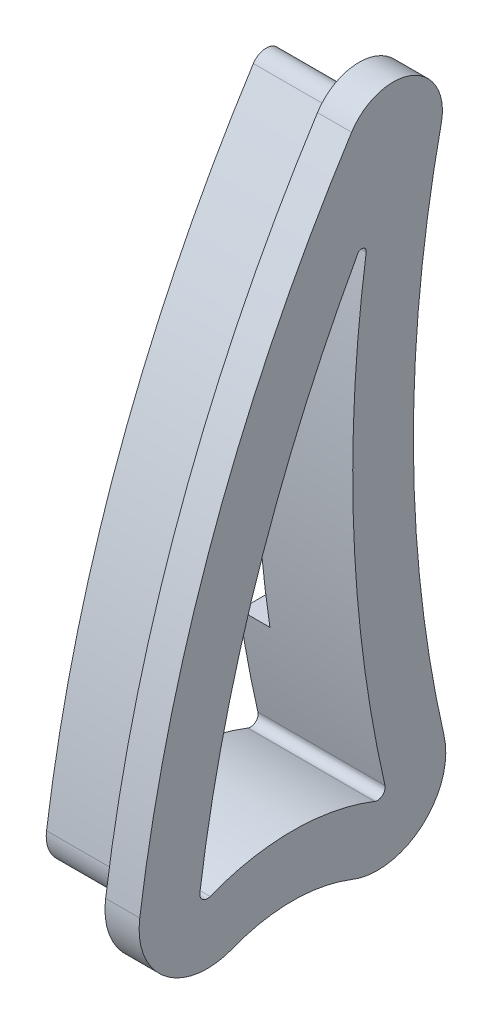
ISO-10303-21;
HEADER;
FILE_DESCRIPTION(('STEP AP214'),'2;1');
FILE_NAME('part.step','',(''),(''),'','','');
FILE_SCHEMA(('AUTOMOTIVE_DESIGN { 1 0 10303 214 1 1 1 1 }'));
ENDSEC;
DATA;
#1=APPLICATION_CONTEXT('core data for automotive mechanical design processes');
#2=APPLICATION_PROTOCOL_DEFINITION('international standard','automotive_design',2000,#1);
#3=PRODUCT_CONTEXT('',#1,'mechanical');
#4=PRODUCT('Part','Part','',(#3));
#5=PRODUCT_RELATED_PRODUCT_CATEGORY('part','',(#4));
#6=PRODUCT_DEFINITION_FORMATION('','',#4);
#7=PRODUCT_DEFINITION_CONTEXT('part definition',#1,'design');
#8=PRODUCT_DEFINITION('design','',#6,#7);
#9=PRODUCT_DEFINITION_SHAPE('','',#8);
#10=(LENGTH_UNIT() NAMED_UNIT(*) SI_UNIT(.MILLI.,.METRE.));
#11=(NAMED_UNIT(*) PLANE_ANGLE_UNIT() SI_UNIT($,.RADIAN.));
#12=(NAMED_UNIT(*) SI_UNIT($,.STERADIAN.) SOLID_ANGLE_UNIT());
#13=UNCERTAINTY_MEASURE_WITH_UNIT(LENGTH_MEASURE(1.E-05),#10,'distance_accuracy_value','');
#14=(GEOMETRIC_REPRESENTATION_CONTEXT(3) GLOBAL_UNCERTAINTY_ASSIGNED_CONTEXT((#13)) GLOBAL_UNIT_ASSIGNED_CONTEXT((#10,
#11,#12)) REPRESENTATION_CONTEXT('',''));
#15=CARTESIAN_POINT('',(0.,0.,0.));
#16=DIRECTION('',(0.,0.,1.));
#17=DIRECTION('',(1.,0.,0.));
#18=AXIS2_PLACEMENT_3D('',#15,#16,#17);
#19=CARTESIAN_POINT('',(0.,-6.20177657240364,-184.198856021998));
#20=DIRECTION('',(1.,0.,0.));
#21=DIRECTION('',(0.,0.,-1.));
#22=AXIS2_PLACEMENT_3D('',#19,#20,#21);
#23=CYLINDRICAL_SURFACE('',#22,210.385678361767);
#24=CARTESIAN_POINT('',(5.08,-6.20177657240364,-184.198856021998));
#25=DIRECTION('',(1.,0.,0.));
#26=DIRECTION('',(0.,0.,-1.));
#27=AXIS2_PLACEMENT_3D('',#24,#25,#26);
#28=CIRCLE('',#27,210.385678361767);
#29=CARTESIAN_POINT('',(5.08,16.9330409285443,24.9109569446311));
#30=VERTEX_POINT('',#29);
#31=CARTESIAN_POINT('',(5.08,-37.6769590714556,23.8190435597259));
#32=VERTEX_POINT('',#31);
#33=EDGE_CURVE('E327',#30,#32,#28,.T.);
#34=ORIENTED_EDGE('',*,*,#33,.F.);
#35=DIRECTION('',(1.,0.,0.));
#36=VECTOR('',#35,1.);
#37=CARTESIAN_POINT('',(0.,16.9330409285443,24.9109569446311));
#38=LINE('',#37,#36);
#39=CARTESIAN_POINT('',(0.,16.9330409285443,24.9109569446311));
#40=VERTEX_POINT('',#39);
#41=EDGE_CURVE('E334',#30,#40,#38,.F.);
#42=ORIENTED_EDGE('',*,*,#41,.T.);
#43=CARTESIAN_POINT('',(0.,-6.20177657240364,-184.198856021998));
#44=DIRECTION('',(-1.,0.,0.));
#45=DIRECTION('',(0.,0.,-1.));
#46=AXIS2_PLACEMENT_3D('',#43,#44,#45);
#47=CIRCLE('',#46,210.385678361767);
#48=CARTESIAN_POINT('',(0.,38.5039666862931,21.3821017037317));
#49=VERTEX_POINT('',#48);
#50=EDGE_CURVE('E380',#40,#49,#47,.T.);
#51=ORIENTED_EDGE('',*,*,#50,.T.);
#52=DIRECTION('',(1.,0.,0.));
#53=VECTOR('',#52,1.);
#54=CARTESIAN_POINT('',(0.,38.5039666862931,21.3821017037317));
#55=LINE('',#54,#53);
#56=CARTESIAN_POINT('',(15.5575,38.5039666862931,21.3821017037317));
#57=VERTEX_POINT('',#56);
#58=EDGE_CURVE('E416',#49,#57,#55,.T.);
#59=ORIENTED_EDGE('',*,*,#58,.T.);
#60=CARTESIAN_POINT('',(15.5575,-6.20177657240364,-184.198856021998));
#61=DIRECTION('',(-1.,0.,0.));
#62=DIRECTION('',(0.,0.,-1.));
#63=AXIS2_PLACEMENT_3D('',#60,#61,#62);
#64=CIRCLE('',#63,210.385678361767);
#65=CARTESIAN_POINT('',(15.5575,-53.0579844312768,20.9026540768476));
#66=VERTEX_POINT('',#65);
#67=EDGE_CURVE('E405',#66,#57,#64,.T.);
#68=ORIENTED_EDGE('',*,*,#67,.F.);
#69=DIRECTION('',(1.,0.,0.));
#70=VECTOR('',#69,1.);
#71=CARTESIAN_POINT('',(0.,-53.0579844312768,20.9026540768476));
#72=LINE('',#71,#70);
#73=CARTESIAN_POINT('',(0.,-53.0579844312768,20.9026540768476));
#74=VERTEX_POINT('',#73);
#75=EDGE_CURVE('E419',#74,#66,#72,.T.);
#76=ORIENTED_EDGE('',*,*,#75,.F.);
#77=CARTESIAN_POINT('',(0.,-37.6769590714556,23.8190435597259));
#78=VERTEX_POINT('',#77);
#79=EDGE_CURVE('E381',#74,#78,#47,.T.);
#80=ORIENTED_EDGE('',*,*,#79,.T.);
#81=DIRECTION('',(1.,0.,0.));
#82=VECTOR('',#81,1.);
#83=CARTESIAN_POINT('',(0.,-37.6769590714556,23.8190435597258));
#84=LINE('',#83,#82);
#85=EDGE_CURVE('E330',#78,#32,#84,.T.);
#86=ORIENTED_EDGE('',*,*,#85,.T.);
#87=EDGE_LOOP('',(#34,#42,#51,#59,#68,#76,#80,#86));
#88=FACE_BOUND('',#87,.T.);
#89=ADVANCED_FACE('F45',(#88),#23,.F.);
#90=CARTESIAN_POINT('',(0.,-70.0279025216978,-58.2002153134541));
#91=DIRECTION('',(1.,0.,0.));
#92=DIRECTION('',(0.,0.,-1.));
#93=AXIS2_PLACEMENT_3D('',#90,#91,#92);
#94=PLANE('',#93);
#95=DIRECTION('',(0.,0.,1.));
#96=VECTOR('',#95,1.);
#97=CARTESIAN_POINT('',(0.,16.9330409285443,11.4890333887427));
#98=LINE('',#97,#96);
#99=CARTESIAN_POINT('',(0.,16.9330409285443,29.3825115749315));
#100=VERTEX_POINT('',#99);
#101=EDGE_CURVE('E304',#40,#100,#98,.T.);
#102=ORIENTED_EDGE('',*,*,#101,.T.);
#103=CARTESIAN_POINT('',(0.,-6.20177657240364,-184.198856021998));
#104=DIRECTION('',(-1.,0.,0.));
#105=DIRECTION('',(0.,0.,-1.));
#106=AXIS2_PLACEMENT_3D('',#103,#104,#105);
#107=CIRCLE('',#106,214.830678361767);
#108=CARTESIAN_POINT('',(0.,24.8697217976994,28.3729726722427));
#109=VERTEX_POINT('',#108);
#110=EDGE_CURVE('E68',#100,#109,#107,.T.);
#111=ORIENTED_EDGE('',*,*,#110,.T.);
#112=CARTESIAN_POINT('',(0.,24.9799317636994,29.1269605789057));
#113=DIRECTION('',(1.,0.,0.));
#114=DIRECTION('',(0.,0.,-1.));
#115=AXIS2_PLACEMENT_3D('',#112,#113,#114);
#116=CIRCLE('',#115,0.762);
#117=CARTESIAN_POINT('',(0.,25.3482363803248,29.794040566143));
#118=VERTEX_POINT('',#117);
#119=EDGE_CURVE('E11',#109,#118,#116,.T.);
#120=ORIENTED_EDGE('',*,*,#119,.T.);
#121=CARTESIAN_POINT('',(0.,-85.725,-171.383815377929));
#122=DIRECTION('',(1.,0.,0.));
#123=DIRECTION('',(0.,0.,-1.));
#124=AXIS2_PLACEMENT_3D('',#121,#122,#123);
#125=CIRCLE('',#124,229.803815377929);
#126=CARTESIAN_POINT('',(0.,-54.1563423384828,56.2413445137298));
#127=VERTEX_POINT('',#126);
#128=EDGE_CURVE('E338',#118,#127,#125,.T.);
#129=ORIENTED_EDGE('',*,*,#128,.T.);
#130=CARTESIAN_POINT('',(0.,-54.3308050433957,54.9833847510209));
#131=DIRECTION('',(1.,0.,0.));
#132=DIRECTION('',(0.,0.,-1.));
#133=AXIS2_PLACEMENT_3D('',#130,#131,#132);
#134=CIRCLE('',#133,1.27);
#135=CARTESIAN_POINT('',(0.,-55.5118273435487,54.5163876134051));
#136=VERTEX_POINT('',#135);
#137=EDGE_CURVE('E205',#127,#136,#134,.T.);
#138=ORIENTED_EDGE('',*,*,#137,.T.);
#139=CARTESIAN_POINT('',(0.,-90.380368501444,40.7287487928118));
#140=DIRECTION('',(-1.,0.,0.));
#141=DIRECTION('',(0.,0.,-1.));
#142=AXIS2_PLACEMENT_3D('',#139,#140,#141);
#143=CIRCLE('',#142,37.495521688956);
#144=CARTESIAN_POINT('',(0.,-55.5118273435487,26.9411099722184));
#145=VERTEX_POINT('',#144);
#146=EDGE_CURVE('E343',#136,#145,#143,.T.);
#147=ORIENTED_EDGE('',*,*,#146,.T.);
#148=CARTESIAN_POINT('',(0.,-54.3308050433957,26.4741128346026));
#149=DIRECTION('',(1.,0.,0.));
#150=DIRECTION('',(0.,0.,-1.));
#151=AXIS2_PLACEMENT_3D('',#148,#149,#150);
#152=CIRCLE('',#151,1.27);
#153=CARTESIAN_POINT('',(0.,-54.0479560184804,25.2360108884348));
#154=VERTEX_POINT('',#153);
#155=EDGE_CURVE('E347',#145,#154,#152,.T.);
#156=ORIENTED_EDGE('',*,*,#155,.T.);
#157=CARTESIAN_POINT('',(0.,-37.6769590714555,28.3135747956562));
#158=VERTEX_POINT('',#157);
#159=EDGE_CURVE('E210',#154,#158,#107,.T.);
#160=ORIENTED_EDGE('',*,*,#159,.T.);
#161=DIRECTION('',(0.,0.,-1.));
#162=VECTOR('',#161,1.);
#163=CARTESIAN_POINT('',(0.,-37.6769590714556,10.3217925721392));
#164=LINE('',#163,#162);
#165=EDGE_CURVE('E309',#158,#78,#164,.T.);
#166=ORIENTED_EDGE('',*,*,#165,.T.);
#167=ORIENTED_EDGE('',*,*,#79,.F.);
#168=CARTESIAN_POINT('',(0.,-54.3308050433957,26.4741128346026));
#169=DIRECTION('',(1.,0.,0.));
#170=DIRECTION('',(0.,0.,-1.));
#171=AXIS2_PLACEMENT_3D('',#168,#169,#170);
#172=CIRCLE('',#171,5.715);
#173=CARTESIAN_POINT('',(0.,-59.6454053940841,28.5755999538737));
#174=VERTEX_POINT('',#173);
#175=EDGE_CURVE('E376',#174,#74,#172,.T.);
#176=ORIENTED_EDGE('',*,*,#175,.F.);
#177=CARTESIAN_POINT('',(0.,-90.380368501444,40.7287487928118));
#178=DIRECTION('',(-1.,0.,0.));
#179=DIRECTION('',(0.,0.,-1.));
#180=AXIS2_PLACEMENT_3D('',#177,#178,#179);
#181=CIRCLE('',#180,33.050521688956);
#182=CARTESIAN_POINT('',(0.,-59.6454053940841,52.8818976317499));
#183=VERTEX_POINT('',#182);
#184=EDGE_CURVE('E372',#183,#174,#181,.T.);
#185=ORIENTED_EDGE('',*,*,#184,.F.);
#186=CARTESIAN_POINT('',(0.,-54.3308050433957,54.9833847510209));
#187=DIRECTION('',(1.,0.,0.));
#188=DIRECTION('',(0.,0.,-1.));
#189=AXIS2_PLACEMENT_3D('',#186,#187,#188);
#190=CIRCLE('',#189,5.715);
#191=CARTESIAN_POINT('',(0.,-53.5457228712878,60.6442036832107));
#192=VERTEX_POINT('',#191);
#193=EDGE_CURVE('E367',#192,#183,#190,.T.);
#194=ORIENTED_EDGE('',*,*,#193,.F.);
#195=CARTESIAN_POINT('',(0.,-85.725,-171.383815377929));
#196=DIRECTION('',(1.,0.,0.));
#197=DIRECTION('',(0.,0.,-1.));
#198=AXIS2_PLACEMENT_3D('',#195,#196,#197);
#199=CIRCLE('',#198,234.248815377929);
#200=CARTESIAN_POINT('',(0.,40.4114208380215,26.0044082934355));
#201=VERTEX_POINT('',#200);
#202=EDGE_CURVE('E363',#201,#192,#199,.T.);
#203=ORIENTED_EDGE('',*,*,#202,.F.);
#204=CARTESIAN_POINT('',(0.,39.0437020369182,23.8640939984993));
#205=DIRECTION('',(1.,0.,0.));
#206=DIRECTION('',(0.,0.,-1.));
#207=AXIS2_PLACEMENT_3D('',#204,#205,#206);
#208=CIRCLE('',#207,2.54);
#209=EDGE_CURVE('E385',#49,#201,#208,.T.);
#210=ORIENTED_EDGE('',*,*,#209,.F.);
#211=ORIENTED_EDGE('',*,*,#50,.F.);
#212=EDGE_LOOP('',(#102,#111,#120,#129,#138,#147,#156,#160,#166,#167,#176,#185,#194,#203,#210,#211));
#213=FACE_BOUND('',#212,.T.);
#214=ADVANCED_FACE('F438',(#213),#94,.F.);
#215=CARTESIAN_POINT('',(0.,-6.20177657240364,-184.198856021998));
#216=DIRECTION('',(1.,0.,0.));
#217=DIRECTION('',(0.,0.,-1.));
#218=AXIS2_PLACEMENT_3D('',#215,#216,#217);
#219=CYLINDRICAL_SURFACE('',#218,214.830678361767);
#220=DIRECTION('',(-1.,0.,0.));
#221=VECTOR('',#220,1.);
#222=CARTESIAN_POINT('',(5.08,16.9330409285443,29.3825115749315));
#223=LINE('',#222,#221);
#224=CARTESIAN_POINT('',(5.08,16.9330409285443,29.3825115749315));
#225=VERTEX_POINT('',#224);
#226=EDGE_CURVE('E324',#225,#100,#223,.T.);
#227=ORIENTED_EDGE('',*,*,#226,.F.);
#228=CARTESIAN_POINT('',(5.08,-6.20177657240364,-184.198856021998));
#229=DIRECTION('',(1.,0.,0.));
#230=DIRECTION('',(0.,0.,-1.));
#231=AXIS2_PLACEMENT_3D('',#228,#229,#230);
#232=CIRCLE('',#231,214.830678361767);
#233=CARTESIAN_POINT('',(5.08,-37.6769590714555,28.3135747956562));
#234=VERTEX_POINT('',#233);
#235=EDGE_CURVE('E308',#225,#234,#232,.T.);
#236=ORIENTED_EDGE('',*,*,#235,.T.);
#237=DIRECTION('',(-1.,0.,0.));
#238=VECTOR('',#237,1.);
#239=CARTESIAN_POINT('',(5.08,-37.6769590714555,28.3135747956562));
#240=LINE('',#239,#238);
#241=EDGE_CURVE('E315',#234,#158,#240,.T.);
#242=ORIENTED_EDGE('',*,*,#241,.T.);
#243=ORIENTED_EDGE('',*,*,#159,.F.);
#244=DIRECTION('',(1.,0.,0.));
#245=VECTOR('',#244,1.);
#246=CARTESIAN_POINT('',(0.,-54.0479560184804,25.2360108884348));
#247=LINE('',#246,#245);
#248=CARTESIAN_POINT('',(21.2725,-54.0479560184804,25.2360108884348));
#249=VERTEX_POINT('',#248);
#250=EDGE_CURVE('E354',#154,#249,#247,.T.);
#251=ORIENTED_EDGE('',*,*,#250,.T.);
#252=CARTESIAN_POINT('',(21.2725,-6.20177657240364,-184.198856021998));
#253=DIRECTION('',(-1.,0.,0.));
#254=DIRECTION('',(0.,0.,-1.));
#255=AXIS2_PLACEMENT_3D('',#252,#253,#254);
#256=CIRCLE('',#255,214.830678361767);
#257=CARTESIAN_POINT('',(21.2725,24.8697217976994,28.3729726722426));
#258=VERTEX_POINT('',#257);
#259=EDGE_CURVE('E235',#249,#258,#256,.T.);
#260=ORIENTED_EDGE('',*,*,#259,.T.);
#261=DIRECTION('',(1.,0.,0.));
#262=VECTOR('',#261,1.);
#263=CARTESIAN_POINT('',(0.,24.8697217976994,28.3729726722426));
#264=LINE('',#263,#262);
#265=EDGE_CURVE('E54',#258,#109,#264,.F.);
#266=ORIENTED_EDGE('',*,*,#265,.T.);
#267=ORIENTED_EDGE('',*,*,#110,.F.);
#268=EDGE_LOOP('',(#227,#236,#242,#243,#251,#260,#266,#267));
#269=FACE_BOUND('',#268,.T.);
#270=ADVANCED_FACE('F435',(#269),#219,.T.);
#271=CARTESIAN_POINT('',(0.,-85.725,-171.383815377929));
#272=DIRECTION('',(1.,0.,0.));
#273=DIRECTION('',(0.,0.,-1.));
#274=AXIS2_PLACEMENT_3D('',#271,#272,#273);
#275=CYLINDRICAL_SURFACE('',#274,234.248815377929);
#276=CARTESIAN_POINT('',(15.5575,-85.725,-171.383815377929));
#277=DIRECTION('',(1.,0.,0.));
#278=DIRECTION('',(0.,0.,-1.));
#279=AXIS2_PLACEMENT_3D('',#276,#277,#278);
#280=CIRCLE('',#279,234.248815377929);
#281=CARTESIAN_POINT('',(15.5575,40.4114208380215,26.0044082934355));
#282=VERTEX_POINT('',#281);
#283=CARTESIAN_POINT('',(15.5575,-53.5457228712878,60.6442036832107));
#284=VERTEX_POINT('',#283);
#285=EDGE_CURVE('E357',#282,#284,#280,.T.);
#286=ORIENTED_EDGE('',*,*,#285,.F.);
#287=DIRECTION('',(1.,0.,0.));
#288=VECTOR('',#287,1.);
#289=CARTESIAN_POINT('',(0.,40.4114208380215,26.0044082934355));
#290=LINE('',#289,#288);
#291=EDGE_CURVE('E412',#201,#282,#290,.T.);
#292=ORIENTED_EDGE('',*,*,#291,.F.);
#293=ORIENTED_EDGE('',*,*,#202,.T.);
#294=DIRECTION('',(1.,0.,0.));
#295=VECTOR('',#294,1.);
#296=CARTESIAN_POINT('',(0.,-53.5457228712878,60.6442036832107));
#297=LINE('',#296,#295);
#298=EDGE_CURVE('E389',#192,#284,#297,.T.);
#299=ORIENTED_EDGE('',*,*,#298,.T.);
#300=EDGE_LOOP('',(#286,#292,#293,#299));
#301=FACE_BOUND('',#300,.T.);
#302=ADVANCED_FACE('F465',(#301),#275,.T.);
#303=CARTESIAN_POINT('',(0.,39.0437020369182,23.8640939984993));
#304=DIRECTION('',(1.,0.,0.));
#305=DIRECTION('',(0.,0.,-1.));
#306=AXIS2_PLACEMENT_3D('',#303,#304,#305);
#307=CYLINDRICAL_SURFACE('',#306,2.54);
#308=CARTESIAN_POINT('',(15.5575,39.0437020369182,23.8640939984993));
#309=DIRECTION('',(1.,0.,0.));
#310=DIRECTION('',(0.,0.,-1.));
#311=AXIS2_PLACEMENT_3D('',#308,#309,#310);
#312=CIRCLE('',#311,2.54);
#313=EDGE_CURVE('E368',#57,#282,#312,.T.);
#314=ORIENTED_EDGE('',*,*,#313,.F.);
#315=ORIENTED_EDGE('',*,*,#58,.F.);
#316=ORIENTED_EDGE('',*,*,#209,.T.);
#317=ORIENTED_EDGE('',*,*,#291,.T.);
#318=EDGE_LOOP('',(#314,#315,#316,#317));
#319=FACE_BOUND('',#318,.T.);
#320=ADVANCED_FACE('F468',(#319),#307,.T.);
#321=CARTESIAN_POINT('',(0.,-54.3308050433957,26.4741128346026));
#322=DIRECTION('',(1.,0.,0.));
#323=DIRECTION('',(0.,0.,-1.));
#324=AXIS2_PLACEMENT_3D('',#321,#322,#323);
#325=CYLINDRICAL_SURFACE('',#324,5.715);
#326=CARTESIAN_POINT('',(15.5575,-54.3308050433957,26.4741128346026));
#327=DIRECTION('',(1.,0.,0.));
#328=DIRECTION('',(0.,0.,-1.));
#329=AXIS2_PLACEMENT_3D('',#326,#327,#328);
#330=CIRCLE('',#329,5.715);
#331=CARTESIAN_POINT('',(15.5575,-59.6454053940841,28.5755999538737));
#332=VERTEX_POINT('',#331);
#333=EDGE_CURVE('E401',#332,#66,#330,.T.);
#334=ORIENTED_EDGE('',*,*,#333,.F.);
#335=DIRECTION('',(1.,0.,0.));
#336=VECTOR('',#335,1.);
#337=CARTESIAN_POINT('',(0.,-59.6454053940841,28.5755999538737));
#338=LINE('',#337,#336);
#339=EDGE_CURVE('E422',#174,#332,#338,.T.);
#340=ORIENTED_EDGE('',*,*,#339,.F.);
#341=ORIENTED_EDGE('',*,*,#175,.T.);
#342=ORIENTED_EDGE('',*,*,#75,.T.);
#343=EDGE_LOOP('',(#334,#340,#341,#342));
#344=FACE_BOUND('',#343,.T.);
#345=ADVANCED_FACE('F453',(#344),#325,.T.);
#346=CARTESIAN_POINT('',(0.,-90.380368501444,40.7287487928118));
#347=DIRECTION('',(1.,0.,0.));
#348=DIRECTION('',(0.,0.,-1.));
#349=AXIS2_PLACEMENT_3D('',#346,#347,#348);
#350=CYLINDRICAL_SURFACE('',#349,33.050521688956);
#351=CARTESIAN_POINT('',(15.5575,-90.380368501444,40.7287487928118));
#352=DIRECTION('',(-1.,0.,0.));
#353=DIRECTION('',(0.,0.,-1.));
#354=AXIS2_PLACEMENT_3D('',#351,#352,#353);
#355=CIRCLE('',#354,33.050521688956);
#356=CARTESIAN_POINT('',(15.5575,-59.6454053940841,52.8818976317499));
#357=VERTEX_POINT('',#356);
#358=EDGE_CURVE('E397',#357,#332,#355,.T.);
#359=ORIENTED_EDGE('',*,*,#358,.F.);
#360=DIRECTION('',(1.,0.,0.));
#361=VECTOR('',#360,1.);
#362=CARTESIAN_POINT('',(0.,-59.6454053940841,52.8818976317499));
#363=LINE('',#362,#361);
#364=EDGE_CURVE('E425',#183,#357,#363,.T.);
#365=ORIENTED_EDGE('',*,*,#364,.F.);
#366=ORIENTED_EDGE('',*,*,#184,.T.);
#367=ORIENTED_EDGE('',*,*,#339,.T.);
#368=EDGE_LOOP('',(#359,#365,#366,#367));
#369=FACE_BOUND('',#368,.T.);
#370=ADVANCED_FACE('F458',(#369),#350,.F.);
#371=CARTESIAN_POINT('',(0.,-54.3308050433957,54.9833847510209));
#372=DIRECTION('',(1.,0.,0.));
#373=DIRECTION('',(0.,0.,-1.));
#374=AXIS2_PLACEMENT_3D('',#371,#372,#373);
#375=CYLINDRICAL_SURFACE('',#374,5.715);
#376=CARTESIAN_POINT('',(15.5575,-54.3308050433957,54.9833847510209));
#377=DIRECTION('',(1.,0.,0.));
#378=DIRECTION('',(0.,0.,-1.));
#379=AXIS2_PLACEMENT_3D('',#376,#377,#378);
#380=CIRCLE('',#379,5.715);
#381=EDGE_CURVE('E393',#284,#357,#380,.T.);
#382=ORIENTED_EDGE('',*,*,#381,.F.);
#383=ORIENTED_EDGE('',*,*,#298,.F.);
#384=ORIENTED_EDGE('',*,*,#193,.T.);
#385=ORIENTED_EDGE('',*,*,#364,.T.);
#386=EDGE_LOOP('',(#382,#383,#384,#385));
#387=FACE_BOUND('',#386,.T.);
#388=ADVANCED_FACE('F461',(#387),#375,.T.);
#389=CARTESIAN_POINT('',(0.,-85.725,-171.383815377929));
#390=DIRECTION('',(1.,0.,0.));
#391=DIRECTION('',(0.,0.,-1.));
#392=AXIS2_PLACEMENT_3D('',#389,#390,#391);
#393=CYLINDRICAL_SURFACE('',#392,229.803815377929);
#394=ORIENTED_EDGE('',*,*,#128,.F.);
#395=DIRECTION('',(1.,0.,0.));
#396=VECTOR('',#395,1.);
#397=CARTESIAN_POINT('',(0.,25.3482363803248,29.794040566143));
#398=LINE('',#397,#396);
#399=CARTESIAN_POINT('',(21.2725,25.3482363803248,29.794040566143));
#400=VERTEX_POINT('',#399);
#401=EDGE_CURVE('E216',#118,#400,#398,.T.);
#402=ORIENTED_EDGE('',*,*,#401,.T.);
#403=CARTESIAN_POINT('',(21.2725,-85.725,-171.383815377929));
#404=DIRECTION('',(1.,0.,0.));
#405=DIRECTION('',(0.,0.,-1.));
#406=AXIS2_PLACEMENT_3D('',#403,#404,#405);
#407=CIRCLE('',#406,229.803815377929);
#408=CARTESIAN_POINT('',(21.2725,-54.1563423384828,56.2413445137298));
#409=VERTEX_POINT('',#408);
#410=EDGE_CURVE('E213',#400,#409,#407,.T.);
#411=ORIENTED_EDGE('',*,*,#410,.T.);
#412=DIRECTION('',(1.,0.,0.));
#413=VECTOR('',#412,1.);
#414=CARTESIAN_POINT('',(0.,-54.1563423384828,56.2413445137298));
#415=LINE('',#414,#413);
#416=EDGE_CURVE('E197',#127,#409,#415,.T.);
#417=ORIENTED_EDGE('',*,*,#416,.F.);
#418=EDGE_LOOP('',(#394,#402,#411,#417));
#419=FACE_BOUND('',#418,.T.);
#420=ADVANCED_FACE('F214',(#419),#393,.F.);
#421=CARTESIAN_POINT('',(0.,-54.3308050433957,26.4741128346026));
#422=DIRECTION('',(1.,0.,0.));
#423=DIRECTION('',(0.,0.,-1.));
#424=AXIS2_PLACEMENT_3D('',#421,#422,#423);
#425=CYLINDRICAL_SURFACE('',#424,1.27);
#426=DIRECTION('',(1.,0.,0.));
#427=VECTOR('',#426,1.);
#428=CARTESIAN_POINT('',(0.,-55.5118273435487,26.9411099722184));
#429=LINE('',#428,#427);
#430=CARTESIAN_POINT('',(21.2725,-55.5118273435487,26.9411099722184));
#431=VERTEX_POINT('',#430);
#432=EDGE_CURVE('E358',#145,#431,#429,.T.);
#433=ORIENTED_EDGE('',*,*,#432,.T.);
#434=CARTESIAN_POINT('',(21.2725,-54.3308050433957,26.4741128346026));
#435=DIRECTION('',(1.,0.,0.));
#436=DIRECTION('',(0.,0.,-1.));
#437=AXIS2_PLACEMENT_3D('',#434,#435,#436);
#438=CIRCLE('',#437,1.27);
#439=EDGE_CURVE('E229',#431,#249,#438,.T.);
#440=ORIENTED_EDGE('',*,*,#439,.T.);
#441=ORIENTED_EDGE('',*,*,#250,.F.);
#442=ORIENTED_EDGE('',*,*,#155,.F.);
#443=EDGE_LOOP('',(#433,#440,#441,#442));
#444=FACE_BOUND('',#443,.T.);
#445=ADVANCED_FACE('F443',(#444),#425,.F.);
#446=CARTESIAN_POINT('',(0.,-90.380368501444,40.7287487928118));
#447=DIRECTION('',(1.,0.,0.));
#448=DIRECTION('',(0.,0.,-1.));
#449=AXIS2_PLACEMENT_3D('',#446,#447,#448);
#450=CYLINDRICAL_SURFACE('',#449,37.495521688956);
#451=DIRECTION('',(1.,0.,0.));
#452=VECTOR('',#451,1.);
#453=CARTESIAN_POINT('',(0.,-55.5118273435487,54.5163876134051));
#454=LINE('',#453,#452);
#455=CARTESIAN_POINT('',(21.2725,-55.5118273435487,54.5163876134051));
#456=VERTEX_POINT('',#455);
#457=EDGE_CURVE('E209',#136,#456,#454,.T.);
#458=ORIENTED_EDGE('',*,*,#457,.T.);
#459=CARTESIAN_POINT('',(21.2725,-90.380368501444,40.7287487928118));
#460=DIRECTION('',(-1.,0.,0.));
#461=DIRECTION('',(0.,0.,-1.));
#462=AXIS2_PLACEMENT_3D('',#459,#460,#461);
#463=CIRCLE('',#462,37.495521688956);
#464=EDGE_CURVE('E225',#456,#431,#463,.T.);
#465=ORIENTED_EDGE('',*,*,#464,.T.);
#466=ORIENTED_EDGE('',*,*,#432,.F.);
#467=ORIENTED_EDGE('',*,*,#146,.F.);
#468=EDGE_LOOP('',(#458,#465,#466,#467));
#469=FACE_BOUND('',#468,.T.);
#470=ADVANCED_FACE('F441',(#469),#450,.T.);
#471=CARTESIAN_POINT('',(0.,-54.3308050433957,54.9833847510209));
#472=DIRECTION('',(1.,0.,0.));
#473=DIRECTION('',(0.,0.,-1.));
#474=AXIS2_PLACEMENT_3D('',#471,#472,#473);
#475=CYLINDRICAL_SURFACE('',#474,1.27);
#476=ORIENTED_EDGE('',*,*,#416,.T.);
#477=CARTESIAN_POINT('',(21.2725,-54.3308050433957,54.9833847510209));
#478=DIRECTION('',(1.,0.,0.));
#479=DIRECTION('',(0.,0.,-1.));
#480=AXIS2_PLACEMENT_3D('',#477,#478,#479);
#481=CIRCLE('',#480,1.27);
#482=EDGE_CURVE('E202',#409,#456,#481,.T.);
#483=ORIENTED_EDGE('',*,*,#482,.T.);
#484=ORIENTED_EDGE('',*,*,#457,.F.);
#485=ORIENTED_EDGE('',*,*,#137,.F.);
#486=EDGE_LOOP('',(#476,#483,#484,#485));
#487=FACE_BOUND('',#486,.T.);
#488=ADVANCED_FACE('F199',(#487),#475,.F.);
#489=CARTESIAN_POINT('',(0.,24.9799317636994,29.1269605789057));
#490=DIRECTION('',(1.,0.,0.));
#491=DIRECTION('',(0.,0.,-1.));
#492=AXIS2_PLACEMENT_3D('',#489,#490,#491);
#493=CYLINDRICAL_SURFACE('',#492,0.762);
#494=ORIENTED_EDGE('',*,*,#119,.F.);
#495=ORIENTED_EDGE('',*,*,#265,.F.);
#496=CARTESIAN_POINT('',(21.2725,24.9799317636994,29.1269605789057));
#497=DIRECTION('',(1.,0.,0.));
#498=DIRECTION('',(0.,0.,-1.));
#499=AXIS2_PLACEMENT_3D('',#496,#497,#498);
#500=CIRCLE('',#499,0.761999999999986);
#501=EDGE_CURVE('E239',#258,#400,#500,.T.);
#502=ORIENTED_EDGE('',*,*,#501,.T.);
#503=ORIENTED_EDGE('',*,*,#401,.F.);
#504=EDGE_LOOP('',(#494,#495,#502,#503));
#505=FACE_BOUND('',#504,.T.);
#506=ADVANCED_FACE('F47',(#505),#493,.F.);
#507=CARTESIAN_POINT('',(5.08,16.9330409285443,11.4890333887427));
#508=DIRECTION('',(0.,-1.,0.));
#509=DIRECTION('',(0.,0.,-1.));
#510=AXIS2_PLACEMENT_3D('',#507,#508,#509);
#511=PLANE('',#510);
#512=DIRECTION('',(0.,0.,1.));
#513=VECTOR('',#512,1.);
#514=CARTESIAN_POINT('',(5.08,16.9330409285443,11.4890333887427));
#515=LINE('',#514,#513);
#516=EDGE_CURVE('E305',#30,#225,#515,.T.);
#517=ORIENTED_EDGE('',*,*,#516,.T.);
#518=ORIENTED_EDGE('',*,*,#226,.T.);
#519=ORIENTED_EDGE('',*,*,#101,.F.);
#520=ORIENTED_EDGE('',*,*,#41,.F.);
#521=EDGE_LOOP('',(#517,#518,#519,#520));
#522=FACE_BOUND('',#521,.T.);
#523=ADVANCED_FACE('F535',(#522),#511,.T.);
#524=CARTESIAN_POINT('',(5.08,-37.6769590714556,10.3217925721392));
#525=DIRECTION('',(0.,1.,0.));
#526=DIRECTION('',(0.,0.,1.));
#527=AXIS2_PLACEMENT_3D('',#524,#525,#526);
#528=PLANE('',#527);
#529=ORIENTED_EDGE('',*,*,#165,.F.);
#530=ORIENTED_EDGE('',*,*,#241,.F.);
#531=DIRECTION('',(0.,0.,-1.));
#532=VECTOR('',#531,1.);
#533=CARTESIAN_POINT('',(5.08,-37.6769590714556,10.3217925721392));
#534=LINE('',#533,#532);
#535=EDGE_CURVE('E61',#234,#32,#534,.T.);
#536=ORIENTED_EDGE('',*,*,#535,.T.);
#537=ORIENTED_EDGE('',*,*,#85,.F.);
#538=EDGE_LOOP('',(#529,#530,#536,#537));
#539=FACE_BOUND('',#538,.T.);
#540=ADVANCED_FACE('F510',(#539),#528,.T.);
#541=CARTESIAN_POINT('',(5.08,-6.20177657240364,-184.198856021998));
#542=DIRECTION('',(1.,0.,0.));
#543=DIRECTION('',(0.,0.,-1.));
#544=AXIS2_PLACEMENT_3D('',#541,#542,#543);
#545=PLANE('',#544);
#546=ORIENTED_EDGE('',*,*,#33,.T.);
#547=ORIENTED_EDGE('',*,*,#535,.F.);
#548=ORIENTED_EDGE('',*,*,#235,.F.);
#549=ORIENTED_EDGE('',*,*,#516,.F.);
#550=EDGE_LOOP('',(#546,#547,#548,#549));
#551=FACE_BOUND('',#550,.T.);
#552=ADVANCED_FACE('F505',(#551),#545,.F.);
#553=CARTESIAN_POINT('',(21.2725,-23.3406489815409,-73.7598606897149));
#554=DIRECTION('',(1.,0.,0.));
#555=DIRECTION('',(0.,0.,-1.));
#556=AXIS2_PLACEMENT_3D('',#553,#554,#555);
#557=PLANE('',#556);
#558=CARTESIAN_POINT('',(21.2725,39.0437020369182,23.8640939984993));
#559=DIRECTION('',(1.,0.,0.));
#560=DIRECTION('',(0.,0.,-1.));
#561=AXIS2_PLACEMENT_3D('',#558,#559,#560);
#562=CIRCLE('',#561,8.25499999999998);
#563=CARTESIAN_POINT('',(21.2725,37.2895621473866,15.7976190405047));
#564=VERTEX_POINT('',#563);
#565=CARTESIAN_POINT('',(21.2725,43.4887881405039,30.8201154570421));
#566=VERTEX_POINT('',#565);
#567=EDGE_CURVE('E243',#564,#566,#562,.T.);
#568=ORIENTED_EDGE('',*,*,#567,.T.);
#569=CARTESIAN_POINT('',(21.2725,-85.725,-171.383815377929));
#570=DIRECTION('',(1.,0.,0.));
#571=DIRECTION('',(0.,0.,-1.));
#572=AXIS2_PLACEMENT_3D('',#569,#570,#571);
#573=CIRCLE('',#572,239.963815377929);
#574=CARTESIAN_POINT('',(21.2725,-52.76064069918,66.3050226154005));
#575=VERTEX_POINT('',#574);
#576=EDGE_CURVE('E247',#566,#575,#573,.T.);
#577=ORIENTED_EDGE('',*,*,#576,.T.);
#578=CARTESIAN_POINT('',(21.2725,-54.3308050433957,54.9833847510209));
#579=DIRECTION('',(1.,0.,0.));
#580=DIRECTION('',(0.,0.,-1.));
#581=AXIS2_PLACEMENT_3D('',#578,#579,#580);
#582=CIRCLE('',#581,11.43);
#583=CARTESIAN_POINT('',(21.2725,-64.9600057447726,50.7804105124788));
#584=VERTEX_POINT('',#583);
#585=EDGE_CURVE('E251',#575,#584,#582,.T.);
#586=ORIENTED_EDGE('',*,*,#585,.T.);
#587=CARTESIAN_POINT('',(21.2725,-90.380368501444,40.7287487928118));
#588=DIRECTION('',(-1.,0.,0.));
#589=DIRECTION('',(0.,0.,-1.));
#590=AXIS2_PLACEMENT_3D('',#587,#588,#589);
#591=CIRCLE('',#590,27.335521688956);
#592=CARTESIAN_POINT('',(21.2725,-64.9600057447726,30.6770870731448));
#593=VERTEX_POINT('',#592);
#594=EDGE_CURVE('E254',#584,#593,#591,.T.);
#595=ORIENTED_EDGE('',*,*,#594,.T.);
#596=CARTESIAN_POINT('',(21.2725,-54.3308050433957,26.4741128346026));
#597=DIRECTION('',(1.,0.,0.));
#598=DIRECTION('',(0.,0.,-1.));
#599=AXIS2_PLACEMENT_3D('',#596,#597,#598);
#600=CIRCLE('',#599,11.43);
#601=CARTESIAN_POINT('',(21.2725,-51.7851638191579,15.3311953190925));
#602=VERTEX_POINT('',#601);
#603=EDGE_CURVE('E257',#593,#602,#600,.T.);
#604=ORIENTED_EDGE('',*,*,#603,.T.);
#605=CARTESIAN_POINT('',(21.2725,-6.20177657240364,-184.198856021998));
#606=DIRECTION('',(-1.,0.,0.));
#607=DIRECTION('',(0.,0.,-1.));
#608=AXIS2_PLACEMENT_3D('',#605,#606,#607);
#609=CIRCLE('',#608,204.670678361767);
#610=EDGE_CURVE('E260',#602,#564,#609,.T.);
#611=ORIENTED_EDGE('',*,*,#610,.T.);
#612=EDGE_LOOP('',(#568,#577,#586,#595,#604,#611));
#613=FACE_BOUND('',#612,.T.);
#614=ORIENTED_EDGE('',*,*,#482,.F.);
#615=ORIENTED_EDGE('',*,*,#410,.F.);
#616=ORIENTED_EDGE('',*,*,#501,.F.);
#617=ORIENTED_EDGE('',*,*,#259,.F.);
#618=ORIENTED_EDGE('',*,*,#439,.F.);
#619=ORIENTED_EDGE('',*,*,#464,.F.);
#620=EDGE_LOOP('',(#614,#615,#616,#617,#618,#619));
#621=FACE_BOUND('',#620,.T.);
#622=ADVANCED_FACE('F222',(#613,#621),#557,.T.);
#623=CARTESIAN_POINT('',(15.5575,-23.3406489815409,-73.7598606897149));
#624=DIRECTION('',(1.,0.,0.));
#625=DIRECTION('',(0.,0.,-1.));
#626=AXIS2_PLACEMENT_3D('',#623,#624,#625);
#627=PLANE('',#626);
#628=ORIENTED_EDGE('',*,*,#313,.T.);
#629=ORIENTED_EDGE('',*,*,#285,.T.);
#630=ORIENTED_EDGE('',*,*,#381,.T.);
#631=ORIENTED_EDGE('',*,*,#358,.T.);
#632=ORIENTED_EDGE('',*,*,#333,.T.);
#633=ORIENTED_EDGE('',*,*,#67,.T.);
#634=EDGE_LOOP('',(#628,#629,#630,#631,#632,#633));
#635=FACE_BOUND('',#634,.T.);
#636=CARTESIAN_POINT('',(15.5575,39.0437020369182,23.8640939984993));
#637=DIRECTION('',(1.,0.,0.));
#638=DIRECTION('',(0.,0.,-1.));
#639=AXIS2_PLACEMENT_3D('',#636,#637,#638);
#640=CIRCLE('',#639,8.25499999999998);
#641=CARTESIAN_POINT('',(15.5575,37.2895621473866,15.7976190405047));
#642=VERTEX_POINT('',#641);
#643=CARTESIAN_POINT('',(15.5575,43.4887881405039,30.8201154570421));
#644=VERTEX_POINT('',#643);
#645=EDGE_CURVE('E242',#642,#644,#640,.T.);
#646=ORIENTED_EDGE('',*,*,#645,.F.);
#647=CARTESIAN_POINT('',(15.5575,-6.20177657240364,-184.198856021998));
#648=DIRECTION('',(-1.,0.,0.));
#649=DIRECTION('',(0.,0.,-1.));
#650=AXIS2_PLACEMENT_3D('',#647,#648,#649);
#651=CIRCLE('',#650,204.670678361767);
#652=CARTESIAN_POINT('',(15.5575,-51.7851638191579,15.3311953190925));
#653=VERTEX_POINT('',#652);
#654=EDGE_CURVE('E248',#653,#642,#651,.T.);
#655=ORIENTED_EDGE('',*,*,#654,.F.);
#656=CARTESIAN_POINT('',(15.5575,-54.3308050433957,26.4741128346026));
#657=DIRECTION('',(1.,0.,0.));
#658=DIRECTION('',(0.,0.,-1.));
#659=AXIS2_PLACEMENT_3D('',#656,#657,#658);
#660=CIRCLE('',#659,11.43);
#661=CARTESIAN_POINT('',(15.5575,-64.9600057447726,30.6770870731448));
#662=VERTEX_POINT('',#661);
#663=EDGE_CURVE('E276',#662,#653,#660,.T.);
#664=ORIENTED_EDGE('',*,*,#663,.F.);
#665=CARTESIAN_POINT('',(15.5575,-90.380368501444,40.7287487928118));
#666=DIRECTION('',(-1.,0.,0.));
#667=DIRECTION('',(0.,0.,-1.));
#668=AXIS2_PLACEMENT_3D('',#665,#666,#667);
#669=CIRCLE('',#668,27.335521688956);
#670=CARTESIAN_POINT('',(15.5575,-64.9600057447726,50.7804105124788));
#671=VERTEX_POINT('',#670);
#672=EDGE_CURVE('E273',#671,#662,#669,.T.);
#673=ORIENTED_EDGE('',*,*,#672,.F.);
#674=CARTESIAN_POINT('',(15.5575,-54.3308050433957,54.9833847510209));
#675=DIRECTION('',(1.,0.,0.));
#676=DIRECTION('',(0.,0.,-1.));
#677=AXIS2_PLACEMENT_3D('',#674,#675,#676);
#678=CIRCLE('',#677,11.43);
#679=CARTESIAN_POINT('',(15.5575,-52.76064069918,66.3050226154005));
#680=VERTEX_POINT('',#679);
#681=EDGE_CURVE('E270',#680,#671,#678,.T.);
#682=ORIENTED_EDGE('',*,*,#681,.F.);
#683=CARTESIAN_POINT('',(15.5575,-85.725,-171.383815377929));
#684=DIRECTION('',(1.,0.,0.));
#685=DIRECTION('',(0.,0.,-1.));
#686=AXIS2_PLACEMENT_3D('',#683,#684,#685);
#687=CIRCLE('',#686,239.963815377929);
#688=EDGE_CURVE('E267',#644,#680,#687,.T.);
#689=ORIENTED_EDGE('',*,*,#688,.F.);
#690=EDGE_LOOP('',(#646,#655,#664,#673,#682,#689));
#691=FACE_BOUND('',#690,.T.);
#692=ADVANCED_FACE('F471',(#635,#691),#627,.F.);
#693=CARTESIAN_POINT('',(21.2725,39.0437020369182,23.8640939984993));
#694=DIRECTION('',(-1.,0.,0.));
#695=DIRECTION('',(0.,0.,1.));
#696=AXIS2_PLACEMENT_3D('',#693,#694,#695);
#697=CYLINDRICAL_SURFACE('',#696,8.25499999999998);
#698=ORIENTED_EDGE('',*,*,#645,.T.);
#699=DIRECTION('',(-1.,0.,0.));
#700=VECTOR('',#699,1.);
#701=CARTESIAN_POINT('',(21.2725,43.4887881405039,30.8201154570421));
#702=LINE('',#701,#700);
#703=EDGE_CURVE('E300',#566,#644,#702,.T.);
#704=ORIENTED_EDGE('',*,*,#703,.F.);
#705=ORIENTED_EDGE('',*,*,#567,.F.);
#706=DIRECTION('',(-1.,0.,0.));
#707=VECTOR('',#706,1.);
#708=CARTESIAN_POINT('',(21.2725,37.2895621473866,15.7976190405047));
#709=LINE('',#708,#707);
#710=EDGE_CURVE('E263',#564,#642,#709,.T.);
#711=ORIENTED_EDGE('',*,*,#710,.T.);
#712=EDGE_LOOP('',(#698,#704,#705,#711));
#713=FACE_BOUND('',#712,.T.);
#714=ADVANCED_FACE('F474',(#713),#697,.T.);
#715=CARTESIAN_POINT('',(21.2725,-85.725,-171.383815377929));
#716=DIRECTION('',(-1.,0.,0.));
#717=DIRECTION('',(0.,0.,1.));
#718=AXIS2_PLACEMENT_3D('',#715,#716,#717);
#719=CYLINDRICAL_SURFACE('',#718,239.963815377929);
#720=ORIENTED_EDGE('',*,*,#688,.T.);
#721=DIRECTION('',(-1.,0.,0.));
#722=VECTOR('',#721,1.);
#723=CARTESIAN_POINT('',(21.2725,-52.76064069918,66.3050226154005));
#724=LINE('',#723,#722);
#725=EDGE_CURVE('E296',#575,#680,#724,.T.);
#726=ORIENTED_EDGE('',*,*,#725,.F.);
#727=ORIENTED_EDGE('',*,*,#576,.F.);
#728=ORIENTED_EDGE('',*,*,#703,.T.);
#729=EDGE_LOOP('',(#720,#726,#727,#728));
#730=FACE_BOUND('',#729,.T.);
#731=ADVANCED_FACE('F502',(#730),#719,.T.);
#732=CARTESIAN_POINT('',(21.2725,-54.3308050433957,54.9833847510209));
#733=DIRECTION('',(-1.,0.,0.));
#734=DIRECTION('',(0.,0.,1.));
#735=AXIS2_PLACEMENT_3D('',#732,#733,#734);
#736=CYLINDRICAL_SURFACE('',#735,11.43);
#737=ORIENTED_EDGE('',*,*,#681,.T.);
#738=DIRECTION('',(-1.,0.,0.));
#739=VECTOR('',#738,1.);
#740=CARTESIAN_POINT('',(21.2725,-64.9600057447726,50.7804105124788));
#741=LINE('',#740,#739);
#742=EDGE_CURVE('E292',#584,#671,#741,.T.);
#743=ORIENTED_EDGE('',*,*,#742,.F.);
#744=ORIENTED_EDGE('',*,*,#585,.F.);
#745=ORIENTED_EDGE('',*,*,#725,.T.);
#746=EDGE_LOOP('',(#737,#743,#744,#745));
#747=FACE_BOUND('',#746,.T.);
#748=ADVANCED_FACE('F499',(#747),#736,.T.);
#749=CARTESIAN_POINT('',(21.2725,-90.380368501444,40.7287487928118));
#750=DIRECTION('',(-1.,0.,0.));
#751=DIRECTION('',(0.,0.,1.));
#752=AXIS2_PLACEMENT_3D('',#749,#750,#751);
#753=CYLINDRICAL_SURFACE('',#752,27.335521688956);
#754=ORIENTED_EDGE('',*,*,#672,.T.);
#755=DIRECTION('',(-1.,0.,0.));
#756=VECTOR('',#755,1.);
#757=CARTESIAN_POINT('',(21.2725,-64.9600057447726,30.6770870731448));
#758=LINE('',#757,#756);
#759=EDGE_CURVE('E288',#593,#662,#758,.T.);
#760=ORIENTED_EDGE('',*,*,#759,.F.);
#761=ORIENTED_EDGE('',*,*,#594,.F.);
#762=ORIENTED_EDGE('',*,*,#742,.T.);
#763=EDGE_LOOP('',(#754,#760,#761,#762));
#764=FACE_BOUND('',#763,.T.);
#765=ADVANCED_FACE('F494',(#764),#753,.F.);
#766=CARTESIAN_POINT('',(21.2725,-54.3308050433957,26.4741128346026));
#767=DIRECTION('',(-1.,0.,0.));
#768=DIRECTION('',(0.,0.,1.));
#769=AXIS2_PLACEMENT_3D('',#766,#767,#768);
#770=CYLINDRICAL_SURFACE('',#769,11.43);
#771=ORIENTED_EDGE('',*,*,#663,.T.);
#772=DIRECTION('',(-1.,0.,0.));
#773=VECTOR('',#772,1.);
#774=CARTESIAN_POINT('',(21.2725,-51.7851638191579,15.3311953190925));
#775=LINE('',#774,#773);
#776=EDGE_CURVE('E284',#602,#653,#775,.T.);
#777=ORIENTED_EDGE('',*,*,#776,.F.);
#778=ORIENTED_EDGE('',*,*,#603,.F.);
#779=ORIENTED_EDGE('',*,*,#759,.T.);
#780=EDGE_LOOP('',(#771,#777,#778,#779));
#781=FACE_BOUND('',#780,.T.);
#782=ADVANCED_FACE('F490',(#781),#770,.T.);
#783=CARTESIAN_POINT('',(21.2725,-6.20177657240364,-184.198856021998));
#784=DIRECTION('',(-1.,0.,0.));
#785=DIRECTION('',(0.,0.,1.));
#786=AXIS2_PLACEMENT_3D('',#783,#784,#785);
#787=CYLINDRICAL_SURFACE('',#786,204.670678361767);
#788=ORIENTED_EDGE('',*,*,#654,.T.);
#789=ORIENTED_EDGE('',*,*,#710,.F.);
#790=ORIENTED_EDGE('',*,*,#610,.F.);
#791=ORIENTED_EDGE('',*,*,#776,.T.);
#792=EDGE_LOOP('',(#788,#789,#790,#791));
#793=FACE_BOUND('',#792,.T.);
#794=ADVANCED_FACE('F486',(#793),#787,.F.);
#795=CLOSED_SHELL('',(#89,#214,#270,#302,#320,#345,#370,#388,#420,#445,#470,#488,#506,#523,#540,
#552,#622,#692,#714,#731,#748,#765,#782,#794));
#796=MANIFOLD_SOLID_BREP('B2',#795);
#797=ADVANCED_BREP_SHAPE_REPRESENTATION('',(#18,#796),#14);
#798=SHAPE_DEFINITION_REPRESENTATION(#9,#797);
ENDSEC;
END-ISO-10303-21;
